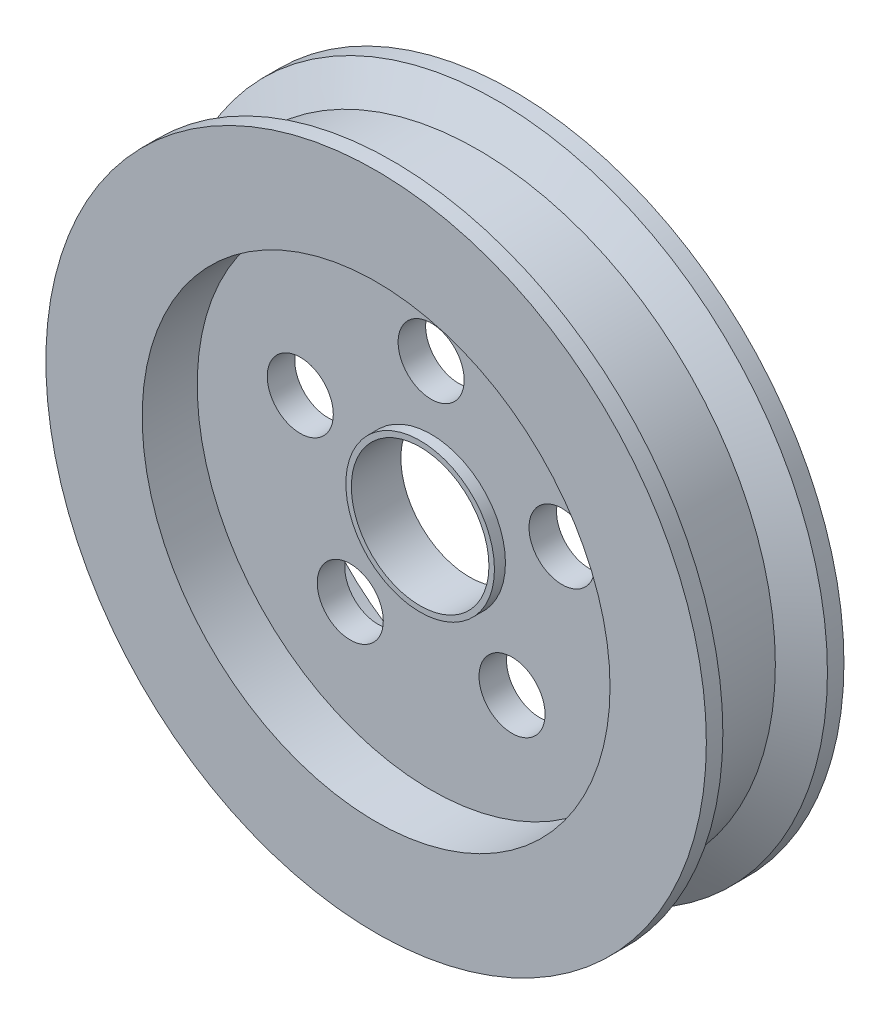
ISO-10303-21;
HEADER;
FILE_DESCRIPTION(('STEP AP214'),'2;1');
FILE_NAME('part.step','',(''),(''),'','','');
FILE_SCHEMA(('AUTOMOTIVE_DESIGN { 1 0 10303 214 1 1 1 1 }'));
ENDSEC;
DATA;
#1=APPLICATION_CONTEXT('core data for automotive mechanical design processes');
#2=APPLICATION_PROTOCOL_DEFINITION('international standard','automotive_design',2000,#1);
#3=PRODUCT_CONTEXT('',#1,'mechanical');
#4=PRODUCT('Part','Part','',(#3));
#5=PRODUCT_RELATED_PRODUCT_CATEGORY('part','',(#4));
#6=PRODUCT_DEFINITION_FORMATION('','',#4);
#7=PRODUCT_DEFINITION_CONTEXT('part definition',#1,'design');
#8=PRODUCT_DEFINITION('design','',#6,#7);
#9=PRODUCT_DEFINITION_SHAPE('','',#8);
#10=(LENGTH_UNIT() NAMED_UNIT(*) SI_UNIT(.MILLI.,.METRE.));
#11=(NAMED_UNIT(*) PLANE_ANGLE_UNIT() SI_UNIT($,.RADIAN.));
#12=(NAMED_UNIT(*) SI_UNIT($,.STERADIAN.) SOLID_ANGLE_UNIT());
#13=UNCERTAINTY_MEASURE_WITH_UNIT(LENGTH_MEASURE(1.E-05),#10,'distance_accuracy_value','');
#14=(GEOMETRIC_REPRESENTATION_CONTEXT(3) GLOBAL_UNCERTAINTY_ASSIGNED_CONTEXT((#13)) GLOBAL_UNIT_ASSIGNED_CONTEXT((#10,
#11,#12)) REPRESENTATION_CONTEXT('',''));
#15=CARTESIAN_POINT('',(0.,0.,0.));
#16=DIRECTION('',(0.,0.,1.));
#17=DIRECTION('',(1.,0.,0.));
#18=AXIS2_PLACEMENT_3D('',#15,#16,#17);
#19=CARTESIAN_POINT('',(0.,0.,12.5));
#20=DIRECTION('',(0.,0.,-1.));
#21=DIRECTION('',(-1.,0.,0.));
#22=AXIS2_PLACEMENT_3D('',#19,#20,#21);
#23=CYLINDRICAL_SURFACE('',#22,60.);
#24=CARTESIAN_POINT('',(0.,0.,-9.5));
#25=DIRECTION('',(0.,0.,1.));
#26=DIRECTION('',(1.,0.,0.));
#27=AXIS2_PLACEMENT_3D('',#24,#25,#26);
#28=CIRCLE('',#27,60.);
#29=CARTESIAN_POINT('',(60.,0.,-9.5));
#30=VERTEX_POINT('',#29);
#31=EDGE_CURVE('E61',#30,#30,#28,.T.);
#32=ORIENTED_EDGE('',*,*,#31,.F.);
#33=EDGE_LOOP('',(#32));
#34=FACE_BOUND('',#33,.T.);
#35=CARTESIAN_POINT('',(0.,0.,-12.5));
#36=DIRECTION('',(0.,0.,1.));
#37=DIRECTION('',(1.,0.,0.));
#38=AXIS2_PLACEMENT_3D('',#35,#36,#37);
#39=CIRCLE('',#38,60.);
#40=CARTESIAN_POINT('',(60.,0.,-12.5));
#41=VERTEX_POINT('',#40);
#42=EDGE_CURVE('E92',#41,#41,#39,.T.);
#43=ORIENTED_EDGE('',*,*,#42,.T.);
#44=EDGE_LOOP('',(#43));
#45=FACE_BOUND('',#44,.T.);
#46=ADVANCED_FACE('F35',(#34,#45),#23,.T.);
#47=CARTESIAN_POINT('',(0.,0.,12.5));
#48=DIRECTION('',(0.,0.,1.));
#49=DIRECTION('',(1.,0.,0.));
#50=AXIS2_PLACEMENT_3D('',#47,#48,#49);
#51=PLANE('',#50);
#52=CARTESIAN_POINT('',(0.,0.,12.5));
#53=DIRECTION('',(0.,0.,1.));
#54=DIRECTION('',(1.,0.,0.));
#55=AXIS2_PLACEMENT_3D('',#52,#53,#54);
#56=CIRCLE('',#55,42.5);
#57=CARTESIAN_POINT('',(42.5,0.,12.5));
#58=VERTEX_POINT('',#57);
#59=EDGE_CURVE('E85',#58,#58,#56,.T.);
#60=ORIENTED_EDGE('',*,*,#59,.F.);
#61=EDGE_LOOP('',(#60));
#62=FACE_BOUND('',#61,.T.);
#63=CARTESIAN_POINT('',(0.,0.,12.5));
#64=DIRECTION('',(0.,0.,1.));
#65=DIRECTION('',(1.,0.,0.));
#66=AXIS2_PLACEMENT_3D('',#63,#64,#65);
#67=CIRCLE('',#66,60.);
#68=CARTESIAN_POINT('',(60.,0.,12.5));
#69=VERTEX_POINT('',#68);
#70=EDGE_CURVE('E47',#69,#69,#67,.T.);
#71=ORIENTED_EDGE('',*,*,#70,.T.);
#72=EDGE_LOOP('',(#71));
#73=FACE_BOUND('',#72,.T.);
#74=ADVANCED_FACE('F140',(#62,#73),#51,.T.);
#75=CARTESIAN_POINT('',(0.,0.,-12.5));
#76=DIRECTION('',(0.,0.,1.));
#77=DIRECTION('',(1.,0.,0.));
#78=AXIS2_PLACEMENT_3D('',#75,#76,#77);
#79=PLANE('',#78);
#80=CARTESIAN_POINT('',(0.,0.,-12.5));
#81=DIRECTION('',(0.,0.,1.));
#82=DIRECTION('',(1.,0.,0.));
#83=AXIS2_PLACEMENT_3D('',#80,#81,#82);
#84=CIRCLE('',#83,42.5);
#85=CARTESIAN_POINT('',(42.5,0.,-12.5));
#86=VERTEX_POINT('',#85);
#87=EDGE_CURVE('E86',#86,#86,#84,.T.);
#88=ORIENTED_EDGE('',*,*,#87,.T.);
#89=EDGE_LOOP('',(#88));
#90=FACE_BOUND('',#89,.T.);
#91=ORIENTED_EDGE('',*,*,#42,.F.);
#92=EDGE_LOOP('',(#91));
#93=FACE_BOUND('',#92,.T.);
#94=ADVANCED_FACE('F137',(#90,#93),#79,.F.);
#95=CARTESIAN_POINT('',(0.,0.,9.5));
#96=DIRECTION('',(0.,0.,1.));
#97=DIRECTION('',(1.,0.,0.));
#98=AXIS2_PLACEMENT_3D('',#95,#96,#97);
#99=CIRCLE('',#98,60.);
#100=CARTESIAN_POINT('',(60.,0.,9.5));
#101=VERTEX_POINT('',#100);
#102=EDGE_CURVE('E52',#101,#101,#99,.T.);
#103=ORIENTED_EDGE('',*,*,#102,.T.);
#104=EDGE_LOOP('',(#103));
#105=FACE_BOUND('',#104,.T.);
#106=ORIENTED_EDGE('',*,*,#70,.F.);
#107=EDGE_LOOP('',(#106));
#108=FACE_BOUND('',#107,.T.);
#109=ADVANCED_FACE('F37',(#105,#108),#23,.T.);
#110=CARTESIAN_POINT('',(0.,0.,2.5));
#111=DIRECTION('',(0.,0.,1.));
#112=DIRECTION('',(1.,0.,0.));
#113=AXIS2_PLACEMENT_3D('',#110,#111,#112);
#114=CYLINDRICAL_SURFACE('',#113,42.5);
#115=CARTESIAN_POINT('',(0.,0.,2.5));
#116=DIRECTION('',(0.,0.,1.));
#117=DIRECTION('',(1.,0.,0.));
#118=AXIS2_PLACEMENT_3D('',#115,#116,#117);
#119=CIRCLE('',#118,42.5);
#120=CARTESIAN_POINT('',(42.5,0.,2.5));
#121=VERTEX_POINT('',#120);
#122=EDGE_CURVE('E89',#121,#121,#119,.T.);
#123=ORIENTED_EDGE('',*,*,#122,.F.);
#124=EDGE_LOOP('',(#123));
#125=FACE_BOUND('',#124,.T.);
#126=ORIENTED_EDGE('',*,*,#59,.T.);
#127=EDGE_LOOP('',(#126));
#128=FACE_BOUND('',#127,.T.);
#129=ADVANCED_FACE('F152',(#125,#128),#114,.F.);
#130=CARTESIAN_POINT('',(0.,0.,2.5));
#131=DIRECTION('',(0.,0.,1.));
#132=DIRECTION('',(1.,0.,0.));
#133=AXIS2_PLACEMENT_3D('',#130,#131,#132);
#134=PLANE('',#133);
#135=CARTESIAN_POINT('',(0.,0.,2.5));
#136=DIRECTION('',(0.,0.,1.));
#137=DIRECTION('',(1.,0.,0.));
#138=AXIS2_PLACEMENT_3D('',#135,#136,#137);
#139=CIRCLE('',#138,13.5);
#140=CARTESIAN_POINT('',(13.5,0.,2.5));
#141=VERTEX_POINT('',#140);
#142=EDGE_CURVE('E10',#141,#141,#139,.T.);
#143=ORIENTED_EDGE('',*,*,#142,.F.);
#144=EDGE_LOOP('',(#143));
#145=FACE_BOUND('',#144,.T.);
#146=CARTESIAN_POINT('',(23.7764129073788,7.72542485937396,2.5));
#147=DIRECTION('',(0.,0.,1.));
#148=DIRECTION('',(0.309016994374958,-0.95105651629515,0.));
#149=AXIS2_PLACEMENT_3D('',#146,#147,#148);
#150=CIRCLE('',#149,6.);
#151=CARTESIAN_POINT('',(29.7764129073788,7.72542485937396,2.5));
#152=VERTEX_POINT('',#151);
#153=EDGE_CURVE('E64',#152,#152,#150,.T.);
#154=ORIENTED_EDGE('',*,*,#153,.F.);
#155=EDGE_LOOP('',(#154));
#156=FACE_BOUND('',#155,.T.);
#157=CARTESIAN_POINT('',(14.694631307312,-20.2254248593736,2.5));
#158=DIRECTION('',(0.,0.,1.));
#159=DIRECTION('',(-0.809016994374942,-0.58778525229248,0.));
#160=AXIS2_PLACEMENT_3D('',#157,#158,#159);
#161=CIRCLE('',#160,6.);
#162=CARTESIAN_POINT('',(20.694631307312,-20.2254248593736,2.5));
#163=VERTEX_POINT('',#162);
#164=EDGE_CURVE('E69',#163,#163,#161,.T.);
#165=ORIENTED_EDGE('',*,*,#164,.F.);
#166=EDGE_LOOP('',(#165));
#167=FACE_BOUND('',#166,.T.);
#168=CARTESIAN_POINT('',(-14.6946313073117,-20.2254248593738,2.5));
#169=DIRECTION('',(0.,0.,1.));
#170=DIRECTION('',(-0.809016994374951,0.587785252292469,0.));
#171=AXIS2_PLACEMENT_3D('',#168,#169,#170);
#172=CIRCLE('',#171,6.);
#173=CARTESIAN_POINT('',(-8.69463130731171,-20.2254248593738,2.5));
#174=VERTEX_POINT('',#173);
#175=EDGE_CURVE('E65',#174,#174,#172,.T.);
#176=ORIENTED_EDGE('',*,*,#175,.F.);
#177=EDGE_LOOP('',(#176));
#178=FACE_BOUND('',#177,.T.);
#179=CARTESIAN_POINT('',(-23.7764129073789,7.72542485937362,2.5));
#180=DIRECTION('',(0.,0.,1.));
#181=DIRECTION('',(0.309016994374945,0.951056516295155,0.));
#182=AXIS2_PLACEMENT_3D('',#179,#180,#181);
#183=CIRCLE('',#182,6.);
#184=CARTESIAN_POINT('',(-17.7764129073789,7.72542485937362,2.5));
#185=VERTEX_POINT('',#184);
#186=EDGE_CURVE('E68',#185,#185,#183,.T.);
#187=ORIENTED_EDGE('',*,*,#186,.F.);
#188=EDGE_LOOP('',(#187));
#189=FACE_BOUND('',#188,.T.);
#190=CARTESIAN_POINT('',(0.,25.,2.5));
#191=DIRECTION('',(0.,0.,1.));
#192=DIRECTION('',(1.,0.,0.));
#193=AXIS2_PLACEMENT_3D('',#190,#191,#192);
#194=CIRCLE('',#193,6.);
#195=CARTESIAN_POINT('',(6.,25.,2.5));
#196=VERTEX_POINT('',#195);
#197=EDGE_CURVE('E77',#196,#196,#194,.T.);
#198=ORIENTED_EDGE('',*,*,#197,.F.);
#199=EDGE_LOOP('',(#198));
#200=FACE_BOUND('',#199,.T.);
#201=ORIENTED_EDGE('',*,*,#122,.T.);
#202=EDGE_LOOP('',(#201));
#203=FACE_BOUND('',#202,.T.);
#204=ADVANCED_FACE('F133',(#145,#156,#167,#178,#189,#200,#203),#134,.T.);
#205=CARTESIAN_POINT('',(0.,0.,-2.5));
#206=DIRECTION('',(0.,0.,-1.));
#207=DIRECTION('',(-1.,0.,0.));
#208=AXIS2_PLACEMENT_3D('',#205,#206,#207);
#209=CYLINDRICAL_SURFACE('',#208,42.5);
#210=CARTESIAN_POINT('',(0.,0.,-2.5));
#211=DIRECTION('',(0.,0.,1.));
#212=DIRECTION('',(1.,0.,0.));
#213=AXIS2_PLACEMENT_3D('',#210,#211,#212);
#214=CIRCLE('',#213,42.5);
#215=CARTESIAN_POINT('',(42.5,0.,-2.5));
#216=VERTEX_POINT('',#215);
#217=EDGE_CURVE('E82',#216,#216,#214,.T.);
#218=ORIENTED_EDGE('',*,*,#217,.T.);
#219=EDGE_LOOP('',(#218));
#220=FACE_BOUND('',#219,.T.);
#221=ORIENTED_EDGE('',*,*,#87,.F.);
#222=EDGE_LOOP('',(#221));
#223=FACE_BOUND('',#222,.T.);
#224=ADVANCED_FACE('F118',(#220,#223),#209,.F.);
#225=CARTESIAN_POINT('',(0.,0.,-2.5));
#226=DIRECTION('',(0.,0.,-1.));
#227=DIRECTION('',(1.,0.,0.));
#228=AXIS2_PLACEMENT_3D('',#225,#226,#227);
#229=PLANE('',#228);
#230=CARTESIAN_POINT('',(0.,0.,-2.5));
#231=DIRECTION('',(0.,0.,-1.));
#232=DIRECTION('',(-1.,0.,0.));
#233=AXIS2_PLACEMENT_3D('',#230,#231,#232);
#234=CIRCLE('',#233,13.5);
#235=CARTESIAN_POINT('',(-13.5,0.,-2.5));
#236=VERTEX_POINT('',#235);
#237=EDGE_CURVE('E39',#236,#236,#234,.T.);
#238=ORIENTED_EDGE('',*,*,#237,.F.);
#239=EDGE_LOOP('',(#238));
#240=FACE_BOUND('',#239,.T.);
#241=CARTESIAN_POINT('',(23.7764129073788,7.72542485937396,-2.5));
#242=DIRECTION('',(0.,0.,-1.));
#243=DIRECTION('',(-1.,0.,0.));
#244=AXIS2_PLACEMENT_3D('',#241,#242,#243);
#245=CIRCLE('',#244,6.);
#246=CARTESIAN_POINT('',(29.7764129073788,7.72542485937396,-2.5));
#247=VERTEX_POINT('',#246);
#248=EDGE_CURVE('E81',#247,#247,#245,.T.);
#249=ORIENTED_EDGE('',*,*,#248,.F.);
#250=EDGE_LOOP('',(#249));
#251=FACE_BOUND('',#250,.T.);
#252=CARTESIAN_POINT('',(14.694631307312,-20.2254248593736,-2.5));
#253=DIRECTION('',(0.,0.,-1.));
#254=DIRECTION('',(-1.,0.,0.));
#255=AXIS2_PLACEMENT_3D('',#252,#253,#254);
#256=CIRCLE('',#255,6.);
#257=CARTESIAN_POINT('',(20.694631307312,-20.2254248593736,-2.5));
#258=VERTEX_POINT('',#257);
#259=EDGE_CURVE('E106',#258,#258,#256,.T.);
#260=ORIENTED_EDGE('',*,*,#259,.F.);
#261=EDGE_LOOP('',(#260));
#262=FACE_BOUND('',#261,.T.);
#263=CARTESIAN_POINT('',(-14.6946313073117,-20.2254248593738,-2.5));
#264=DIRECTION('',(0.,0.,-1.));
#265=DIRECTION('',(-1.,0.,0.));
#266=AXIS2_PLACEMENT_3D('',#263,#264,#265);
#267=CIRCLE('',#266,6.);
#268=CARTESIAN_POINT('',(-8.69463130731171,-20.2254248593738,-2.5));
#269=VERTEX_POINT('',#268);
#270=EDGE_CURVE('E103',#269,#269,#267,.T.);
#271=ORIENTED_EDGE('',*,*,#270,.F.);
#272=EDGE_LOOP('',(#271));
#273=FACE_BOUND('',#272,.T.);
#274=CARTESIAN_POINT('',(-23.7764129073789,7.72542485937362,-2.5));
#275=DIRECTION('',(0.,0.,-1.));
#276=DIRECTION('',(-1.,0.,0.));
#277=AXIS2_PLACEMENT_3D('',#274,#275,#276);
#278=CIRCLE('',#277,6.);
#279=CARTESIAN_POINT('',(-17.7764129073789,7.72542485937362,-2.5));
#280=VERTEX_POINT('',#279);
#281=EDGE_CURVE('E76',#280,#280,#278,.T.);
#282=ORIENTED_EDGE('',*,*,#281,.F.);
#283=EDGE_LOOP('',(#282));
#284=FACE_BOUND('',#283,.T.);
#285=CARTESIAN_POINT('',(0.,25.,-2.5));
#286=DIRECTION('',(0.,0.,-1.));
#287=DIRECTION('',(-1.,0.,0.));
#288=AXIS2_PLACEMENT_3D('',#285,#286,#287);
#289=CIRCLE('',#288,6.);
#290=CARTESIAN_POINT('',(6.,25.,-2.5));
#291=VERTEX_POINT('',#290);
#292=EDGE_CURVE('E80',#291,#291,#289,.T.);
#293=ORIENTED_EDGE('',*,*,#292,.F.);
#294=EDGE_LOOP('',(#293));
#295=FACE_BOUND('',#294,.T.);
#296=ORIENTED_EDGE('',*,*,#217,.F.);
#297=EDGE_LOOP('',(#296));
#298=FACE_BOUND('',#297,.T.);
#299=ADVANCED_FACE('F114',(#240,#251,#262,#273,#284,#295,#298),#229,.T.);
#300=CARTESIAN_POINT('',(0.,25.,-12.5));
#301=DIRECTION('',(0.,0.,1.));
#302=DIRECTION('',(1.,0.,0.));
#303=AXIS2_PLACEMENT_3D('',#300,#301,#302);
#304=CYLINDRICAL_SURFACE('',#303,6.);
#305=CARTESIAN_POINT('',(6.,25.,-2.5));
#306=CARTESIAN_POINT('',(6.,25.,-2.44791666666667));
#307=CARTESIAN_POINT('',(6.,25.,-2.39583333333333));
#308=CARTESIAN_POINT('',(6.,25.,-2.29166666666667));
#309=CARTESIAN_POINT('',(6.,25.,-2.23958333333333));
#310=CARTESIAN_POINT('',(6.,25.,-2.13541666666667));
#311=CARTESIAN_POINT('',(6.,25.,-2.08333333333333));
#312=CARTESIAN_POINT('',(6.,25.,-1.97916666666667));
#313=CARTESIAN_POINT('',(6.,25.,-1.92708333333333));
#314=CARTESIAN_POINT('',(6.,25.,-1.82291666666667));
#315=CARTESIAN_POINT('',(6.,25.,-1.77083333333333));
#316=CARTESIAN_POINT('',(6.,25.,-1.66666666666667));
#317=CARTESIAN_POINT('',(6.,25.,-1.61458333333333));
#318=CARTESIAN_POINT('',(6.,25.,-1.51041666666667));
#319=CARTESIAN_POINT('',(6.,25.,-1.45833333333333));
#320=CARTESIAN_POINT('',(6.,25.,-1.35416666666667));
#321=CARTESIAN_POINT('',(6.,25.,-1.30208333333333));
#322=CARTESIAN_POINT('',(6.,25.,-1.19791666666667));
#323=CARTESIAN_POINT('',(6.,25.,-1.14583333333333));
#324=CARTESIAN_POINT('',(6.,25.,-1.04166666666667));
#325=CARTESIAN_POINT('',(6.,25.,-0.989583333333334));
#326=CARTESIAN_POINT('',(6.,25.,-0.885416666666668));
#327=CARTESIAN_POINT('',(6.,25.,-0.833333333333334));
#328=CARTESIAN_POINT('',(6.,25.,-0.729166666666667));
#329=CARTESIAN_POINT('',(6.,25.,-0.677083333333334));
#330=CARTESIAN_POINT('',(6.,25.,-0.572916666666667));
#331=CARTESIAN_POINT('',(6.,25.,-0.520833333333334));
#332=CARTESIAN_POINT('',(6.,25.,-0.416666666666667));
#333=CARTESIAN_POINT('',(6.,25.,-0.364583333333334));
#334=CARTESIAN_POINT('',(6.,25.,-0.260416666666667));
#335=CARTESIAN_POINT('',(6.,25.,-0.208333333333334));
#336=CARTESIAN_POINT('',(6.,25.,-0.104166666666667));
#337=CARTESIAN_POINT('',(6.,25.,-0.0520833333333334));
#338=CARTESIAN_POINT('',(6.,25.,0.0520833333333334));
#339=CARTESIAN_POINT('',(6.,25.,0.104166666666667));
#340=CARTESIAN_POINT('',(6.,25.,0.208333333333334));
#341=CARTESIAN_POINT('',(6.,25.,0.260416666666667));
#342=CARTESIAN_POINT('',(6.,25.,0.364583333333334));
#343=CARTESIAN_POINT('',(6.,25.,0.416666666666667));
#344=CARTESIAN_POINT('',(6.,25.,0.520833333333334));
#345=CARTESIAN_POINT('',(6.,25.,0.572916666666667));
#346=CARTESIAN_POINT('',(6.,25.,0.677083333333334));
#347=CARTESIAN_POINT('',(6.,25.,0.729166666666667));
#348=CARTESIAN_POINT('',(6.,25.,0.833333333333333));
#349=CARTESIAN_POINT('',(6.,25.,0.885416666666666));
#350=CARTESIAN_POINT('',(6.,25.,0.989583333333333));
#351=CARTESIAN_POINT('',(6.,25.,1.04166666666667));
#352=CARTESIAN_POINT('',(6.,25.,1.14583333333333));
#353=CARTESIAN_POINT('',(6.,25.,1.19791666666667));
#354=CARTESIAN_POINT('',(6.,25.,1.30208333333333));
#355=CARTESIAN_POINT('',(6.,25.,1.35416666666667));
#356=CARTESIAN_POINT('',(6.,25.,1.45833333333333));
#357=CARTESIAN_POINT('',(6.,25.,1.51041666666667));
#358=CARTESIAN_POINT('',(6.,25.,1.61458333333333));
#359=CARTESIAN_POINT('',(6.,25.,1.66666666666667));
#360=CARTESIAN_POINT('',(6.,25.,1.77083333333333));
#361=CARTESIAN_POINT('',(6.,25.,1.82291666666667));
#362=CARTESIAN_POINT('',(6.,25.,1.92708333333333));
#363=CARTESIAN_POINT('',(6.,25.,1.97916666666667));
#364=CARTESIAN_POINT('',(6.,25.,2.08333333333333));
#365=CARTESIAN_POINT('',(6.,25.,2.13541666666667));
#366=CARTESIAN_POINT('',(6.,25.,2.23958333333333));
#367=CARTESIAN_POINT('',(6.,25.,2.29166666666667));
#368=CARTESIAN_POINT('',(6.,25.,2.39583333333333));
#369=CARTESIAN_POINT('',(6.,25.,2.44791666666667));
#370=CARTESIAN_POINT('',(6.,25.,2.5));
#371=B_SPLINE_CURVE_WITH_KNOTS('',3,(#305,#306,#307,#308,#309,#310,#311,#312,#313,#314,#315,
#316,#317,#318,#319,#320,#321,#322,#323,#324,#325,#326,#327,#328,#329,#330,#331,#332,#333,#334,
#335,#336,#337,#338,#339,#340,#341,#342,#343,#344,#345,#346,#347,#348,#349,#350,#351,#352,#353,
#354,#355,#356,#357,#358,#359,#360,#361,#362,#363,#364,#365,#366,#367,#368,#369,#370),
.UNSPECIFIED.,.F.,.F.,(4,2,2,2,2,2,2,2,2,2,2,2,2,2,2,2,2,2,2,2,2,2,2,2,2,2,2,2,2,2,2,2,4),(0.,
0.15625,0.3125,0.46875,0.625000000000001,0.781250000000001,0.937500000000001,1.09375,1.25,
1.40625,1.5625,1.71875,1.875,2.03125,2.1875,2.34375,2.5,2.65625,2.8125,2.96875,3.125,3.28125,
3.4375,3.59375,3.75,3.90625,4.0625,4.21875,4.375,4.53125,4.6875,4.84375,5.),.UNSPECIFIED.);
#372=EDGE_CURVE('BSEAM117',#291,#196,#371,.T.);
#373=ORIENTED_EDGE('',*,*,#292,.T.);
#374=ORIENTED_EDGE('',*,*,#197,.T.);
#375=ORIENTED_EDGE('',*,*,#372,.T.);
#376=ORIENTED_EDGE('',*,*,#372,.F.);
#377=EDGE_LOOP('',(#373,#375,#374,#376));
#378=FACE_BOUND('',#377,.T.);
#379=ADVANCED_FACE('F117',(#378),#304,.F.);
#380=CARTESIAN_POINT('',(-23.7764129073789,7.72542485937362,-12.5));
#381=DIRECTION('',(0.,0.,1.));
#382=DIRECTION('',(1.,0.,0.));
#383=AXIS2_PLACEMENT_3D('',#380,#381,#382);
#384=CYLINDRICAL_SURFACE('',#383,6.);
#385=CARTESIAN_POINT('',(-17.7764129073789,7.72542485937362,-2.5));
#386=CARTESIAN_POINT('',(-17.7764129073789,7.72542485937362,-2.44791666666667));
#387=CARTESIAN_POINT('',(-17.7764129073789,7.72542485937362,-2.39583333333333));
#388=CARTESIAN_POINT('',(-17.7764129073789,7.72542485937362,-2.29166666666667));
#389=CARTESIAN_POINT('',(-17.7764129073789,7.72542485937362,-2.23958333333333));
#390=CARTESIAN_POINT('',(-17.7764129073789,7.72542485937362,-2.13541666666667));
#391=CARTESIAN_POINT('',(-17.7764129073789,7.72542485937362,-2.08333333333333));
#392=CARTESIAN_POINT('',(-17.7764129073789,7.72542485937362,-1.97916666666667));
#393=CARTESIAN_POINT('',(-17.7764129073789,7.72542485937362,-1.92708333333333));
#394=CARTESIAN_POINT('',(-17.7764129073789,7.72542485937362,-1.82291666666667));
#395=CARTESIAN_POINT('',(-17.7764129073789,7.72542485937362,-1.77083333333333));
#396=CARTESIAN_POINT('',(-17.7764129073789,7.72542485937362,-1.66666666666667));
#397=CARTESIAN_POINT('',(-17.7764129073789,7.72542485937362,-1.61458333333333));
#398=CARTESIAN_POINT('',(-17.7764129073789,7.72542485937362,-1.51041666666667));
#399=CARTESIAN_POINT('',(-17.7764129073789,7.72542485937362,-1.45833333333333));
#400=CARTESIAN_POINT('',(-17.7764129073789,7.72542485937362,-1.35416666666667));
#401=CARTESIAN_POINT('',(-17.7764129073789,7.72542485937362,-1.30208333333333));
#402=CARTESIAN_POINT('',(-17.7764129073789,7.72542485937362,-1.19791666666667));
#403=CARTESIAN_POINT('',(-17.7764129073789,7.72542485937362,-1.14583333333333));
#404=CARTESIAN_POINT('',(-17.7764129073789,7.72542485937362,-1.04166666666667));
#405=CARTESIAN_POINT('',(-17.7764129073789,7.72542485937362,-0.989583333333334));
#406=CARTESIAN_POINT('',(-17.7764129073789,7.72542485937362,-0.885416666666668));
#407=CARTESIAN_POINT('',(-17.7764129073789,7.72542485937362,-0.833333333333334));
#408=CARTESIAN_POINT('',(-17.7764129073789,7.72542485937362,-0.729166666666667));
#409=CARTESIAN_POINT('',(-17.7764129073789,7.72542485937362,-0.677083333333334));
#410=CARTESIAN_POINT('',(-17.7764129073789,7.72542485937362,-0.572916666666667));
#411=CARTESIAN_POINT('',(-17.7764129073789,7.72542485937362,-0.520833333333334));
#412=CARTESIAN_POINT('',(-17.7764129073789,7.72542485937362,-0.416666666666667));
#413=CARTESIAN_POINT('',(-17.7764129073789,7.72542485937362,-0.364583333333334));
#414=CARTESIAN_POINT('',(-17.7764129073789,7.72542485937362,-0.260416666666667));
#415=CARTESIAN_POINT('',(-17.7764129073789,7.72542485937362,-0.208333333333334));
#416=CARTESIAN_POINT('',(-17.7764129073789,7.72542485937362,-0.104166666666667));
#417=CARTESIAN_POINT('',(-17.7764129073789,7.72542485937362,-0.0520833333333334));
#418=CARTESIAN_POINT('',(-17.7764129073789,7.72542485937362,0.0520833333333334));
#419=CARTESIAN_POINT('',(-17.7764129073789,7.72542485937362,0.104166666666667));
#420=CARTESIAN_POINT('',(-17.7764129073789,7.72542485937362,0.208333333333334));
#421=CARTESIAN_POINT('',(-17.7764129073789,7.72542485937362,0.260416666666667));
#422=CARTESIAN_POINT('',(-17.7764129073789,7.72542485937362,0.364583333333334));
#423=CARTESIAN_POINT('',(-17.7764129073789,7.72542485937362,0.416666666666667));
#424=CARTESIAN_POINT('',(-17.7764129073789,7.72542485937362,0.520833333333334));
#425=CARTESIAN_POINT('',(-17.7764129073789,7.72542485937362,0.572916666666667));
#426=CARTESIAN_POINT('',(-17.7764129073789,7.72542485937362,0.677083333333334));
#427=CARTESIAN_POINT('',(-17.7764129073789,7.72542485937362,0.729166666666667));
#428=CARTESIAN_POINT('',(-17.7764129073789,7.72542485937362,0.833333333333333));
#429=CARTESIAN_POINT('',(-17.7764129073789,7.72542485937362,0.885416666666666));
#430=CARTESIAN_POINT('',(-17.7764129073789,7.72542485937362,0.989583333333333));
#431=CARTESIAN_POINT('',(-17.7764129073789,7.72542485937362,1.04166666666667));
#432=CARTESIAN_POINT('',(-17.7764129073789,7.72542485937362,1.14583333333333));
#433=CARTESIAN_POINT('',(-17.7764129073789,7.72542485937362,1.19791666666667));
#434=CARTESIAN_POINT('',(-17.7764129073789,7.72542485937362,1.30208333333333));
#435=CARTESIAN_POINT('',(-17.7764129073789,7.72542485937362,1.35416666666667));
#436=CARTESIAN_POINT('',(-17.7764129073789,7.72542485937362,1.45833333333333));
#437=CARTESIAN_POINT('',(-17.7764129073789,7.72542485937362,1.51041666666667));
#438=CARTESIAN_POINT('',(-17.7764129073789,7.72542485937362,1.61458333333333));
#439=CARTESIAN_POINT('',(-17.7764129073789,7.72542485937362,1.66666666666667));
#440=CARTESIAN_POINT('',(-17.7764129073789,7.72542485937362,1.77083333333333));
#441=CARTESIAN_POINT('',(-17.7764129073789,7.72542485937362,1.82291666666667));
#442=CARTESIAN_POINT('',(-17.7764129073789,7.72542485937362,1.92708333333333));
#443=CARTESIAN_POINT('',(-17.7764129073789,7.72542485937362,1.97916666666667));
#444=CARTESIAN_POINT('',(-17.7764129073789,7.72542485937362,2.08333333333333));
#445=CARTESIAN_POINT('',(-17.7764129073789,7.72542485937362,2.13541666666667));
#446=CARTESIAN_POINT('',(-17.7764129073789,7.72542485937362,2.23958333333333));
#447=CARTESIAN_POINT('',(-17.7764129073789,7.72542485937362,2.29166666666667));
#448=CARTESIAN_POINT('',(-17.7764129073789,7.72542485937362,2.39583333333333));
#449=CARTESIAN_POINT('',(-17.7764129073789,7.72542485937362,2.44791666666667));
#450=CARTESIAN_POINT('',(-17.7764129073789,7.72542485937362,2.5));
#451=B_SPLINE_CURVE_WITH_KNOTS('',3,(#385,#386,#387,#388,#389,#390,#391,#392,#393,#394,#395,
#396,#397,#398,#399,#400,#401,#402,#403,#404,#405,#406,#407,#408,#409,#410,#411,#412,#413,#414,
#415,#416,#417,#418,#419,#420,#421,#422,#423,#424,#425,#426,#427,#428,#429,#430,#431,#432,#433,
#434,#435,#436,#437,#438,#439,#440,#441,#442,#443,#444,#445,#446,#447,#448,#449,#450),
.UNSPECIFIED.,.F.,.F.,(4,2,2,2,2,2,2,2,2,2,2,2,2,2,2,2,2,2,2,2,2,2,2,2,2,2,2,2,2,2,2,2,4),(0.,
0.15625,0.3125,0.46875,0.625000000000001,0.781250000000001,0.937500000000001,1.09375,1.25,
1.40625,1.5625,1.71875,1.875,2.03125,2.1875,2.34375,2.5,2.65625,2.8125,2.96875,3.125,3.28125,
3.4375,3.59375,3.75,3.90625,4.0625,4.21875,4.375,4.53125,4.6875,4.84375,5.),.UNSPECIFIED.);
#452=EDGE_CURVE('BSEAM190',#280,#185,#451,.T.);
#453=ORIENTED_EDGE('',*,*,#281,.T.);
#454=ORIENTED_EDGE('',*,*,#186,.T.);
#455=ORIENTED_EDGE('',*,*,#452,.T.);
#456=ORIENTED_EDGE('',*,*,#452,.F.);
#457=EDGE_LOOP('',(#453,#455,#454,#456));
#458=FACE_BOUND('',#457,.T.);
#459=ADVANCED_FACE('F190',(#458),#384,.F.);
#460=CARTESIAN_POINT('',(-14.6946313073117,-20.2254248593738,-12.5));
#461=DIRECTION('',(0.,0.,1.));
#462=DIRECTION('',(1.,0.,0.));
#463=AXIS2_PLACEMENT_3D('',#460,#461,#462);
#464=CYLINDRICAL_SURFACE('',#463,6.);
#465=CARTESIAN_POINT('',(-8.69463130731171,-20.2254248593738,-2.5));
#466=CARTESIAN_POINT('',(-8.69463130731171,-20.2254248593738,-2.44791666666667));
#467=CARTESIAN_POINT('',(-8.69463130731171,-20.2254248593738,-2.39583333333333));
#468=CARTESIAN_POINT('',(-8.69463130731171,-20.2254248593738,-2.29166666666667));
#469=CARTESIAN_POINT('',(-8.69463130731171,-20.2254248593738,-2.23958333333333));
#470=CARTESIAN_POINT('',(-8.69463130731171,-20.2254248593738,-2.13541666666667));
#471=CARTESIAN_POINT('',(-8.69463130731171,-20.2254248593738,-2.08333333333333));
#472=CARTESIAN_POINT('',(-8.69463130731171,-20.2254248593738,-1.97916666666667));
#473=CARTESIAN_POINT('',(-8.69463130731171,-20.2254248593738,-1.92708333333333));
#474=CARTESIAN_POINT('',(-8.69463130731171,-20.2254248593738,-1.82291666666667));
#475=CARTESIAN_POINT('',(-8.69463130731171,-20.2254248593738,-1.77083333333333));
#476=CARTESIAN_POINT('',(-8.69463130731171,-20.2254248593738,-1.66666666666667));
#477=CARTESIAN_POINT('',(-8.69463130731171,-20.2254248593738,-1.61458333333333));
#478=CARTESIAN_POINT('',(-8.69463130731171,-20.2254248593738,-1.51041666666667));
#479=CARTESIAN_POINT('',(-8.69463130731171,-20.2254248593738,-1.45833333333333));
#480=CARTESIAN_POINT('',(-8.69463130731171,-20.2254248593738,-1.35416666666667));
#481=CARTESIAN_POINT('',(-8.69463130731171,-20.2254248593738,-1.30208333333333));
#482=CARTESIAN_POINT('',(-8.69463130731171,-20.2254248593738,-1.19791666666667));
#483=CARTESIAN_POINT('',(-8.69463130731171,-20.2254248593738,-1.14583333333333));
#484=CARTESIAN_POINT('',(-8.69463130731171,-20.2254248593738,-1.04166666666667));
#485=CARTESIAN_POINT('',(-8.69463130731171,-20.2254248593738,-0.989583333333334));
#486=CARTESIAN_POINT('',(-8.69463130731171,-20.2254248593738,-0.885416666666668));
#487=CARTESIAN_POINT('',(-8.69463130731171,-20.2254248593738,-0.833333333333334));
#488=CARTESIAN_POINT('',(-8.69463130731171,-20.2254248593738,-0.729166666666667));
#489=CARTESIAN_POINT('',(-8.69463130731171,-20.2254248593738,-0.677083333333334));
#490=CARTESIAN_POINT('',(-8.69463130731171,-20.2254248593738,-0.572916666666667));
#491=CARTESIAN_POINT('',(-8.69463130731171,-20.2254248593738,-0.520833333333334));
#492=CARTESIAN_POINT('',(-8.69463130731171,-20.2254248593738,-0.416666666666667));
#493=CARTESIAN_POINT('',(-8.69463130731171,-20.2254248593738,-0.364583333333334));
#494=CARTESIAN_POINT('',(-8.69463130731171,-20.2254248593738,-0.260416666666667));
#495=CARTESIAN_POINT('',(-8.69463130731171,-20.2254248593738,-0.208333333333334));
#496=CARTESIAN_POINT('',(-8.69463130731171,-20.2254248593738,-0.104166666666667));
#497=CARTESIAN_POINT('',(-8.69463130731171,-20.2254248593738,-0.0520833333333334));
#498=CARTESIAN_POINT('',(-8.69463130731171,-20.2254248593738,0.0520833333333334));
#499=CARTESIAN_POINT('',(-8.69463130731171,-20.2254248593738,0.104166666666667));
#500=CARTESIAN_POINT('',(-8.69463130731171,-20.2254248593738,0.208333333333334));
#501=CARTESIAN_POINT('',(-8.69463130731171,-20.2254248593738,0.260416666666667));
#502=CARTESIAN_POINT('',(-8.69463130731171,-20.2254248593738,0.364583333333334));
#503=CARTESIAN_POINT('',(-8.69463130731171,-20.2254248593738,0.416666666666667));
#504=CARTESIAN_POINT('',(-8.69463130731171,-20.2254248593738,0.520833333333334));
#505=CARTESIAN_POINT('',(-8.69463130731171,-20.2254248593738,0.572916666666667));
#506=CARTESIAN_POINT('',(-8.69463130731171,-20.2254248593738,0.677083333333334));
#507=CARTESIAN_POINT('',(-8.69463130731171,-20.2254248593738,0.729166666666667));
#508=CARTESIAN_POINT('',(-8.69463130731171,-20.2254248593738,0.833333333333333));
#509=CARTESIAN_POINT('',(-8.69463130731171,-20.2254248593738,0.885416666666666));
#510=CARTESIAN_POINT('',(-8.69463130731171,-20.2254248593738,0.989583333333333));
#511=CARTESIAN_POINT('',(-8.69463130731171,-20.2254248593738,1.04166666666667));
#512=CARTESIAN_POINT('',(-8.69463130731171,-20.2254248593738,1.14583333333333));
#513=CARTESIAN_POINT('',(-8.69463130731171,-20.2254248593738,1.19791666666667));
#514=CARTESIAN_POINT('',(-8.69463130731171,-20.2254248593738,1.30208333333333));
#515=CARTESIAN_POINT('',(-8.69463130731171,-20.2254248593738,1.35416666666667));
#516=CARTESIAN_POINT('',(-8.69463130731171,-20.2254248593738,1.45833333333333));
#517=CARTESIAN_POINT('',(-8.69463130731171,-20.2254248593738,1.51041666666667));
#518=CARTESIAN_POINT('',(-8.69463130731171,-20.2254248593738,1.61458333333333));
#519=CARTESIAN_POINT('',(-8.69463130731171,-20.2254248593738,1.66666666666667));
#520=CARTESIAN_POINT('',(-8.69463130731171,-20.2254248593738,1.77083333333333));
#521=CARTESIAN_POINT('',(-8.69463130731171,-20.2254248593738,1.82291666666667));
#522=CARTESIAN_POINT('',(-8.69463130731171,-20.2254248593738,1.92708333333333));
#523=CARTESIAN_POINT('',(-8.69463130731171,-20.2254248593738,1.97916666666667));
#524=CARTESIAN_POINT('',(-8.69463130731171,-20.2254248593738,2.08333333333333));
#525=CARTESIAN_POINT('',(-8.69463130731171,-20.2254248593738,2.13541666666667));
#526=CARTESIAN_POINT('',(-8.69463130731171,-20.2254248593738,2.23958333333333));
#527=CARTESIAN_POINT('',(-8.69463130731171,-20.2254248593738,2.29166666666667));
#528=CARTESIAN_POINT('',(-8.69463130731171,-20.2254248593738,2.39583333333333));
#529=CARTESIAN_POINT('',(-8.69463130731171,-20.2254248593738,2.44791666666667));
#530=CARTESIAN_POINT('',(-8.69463130731171,-20.2254248593738,2.5));
#531=B_SPLINE_CURVE_WITH_KNOTS('',3,(#465,#466,#467,#468,#469,#470,#471,#472,#473,#474,#475,
#476,#477,#478,#479,#480,#481,#482,#483,#484,#485,#486,#487,#488,#489,#490,#491,#492,#493,#494,
#495,#496,#497,#498,#499,#500,#501,#502,#503,#504,#505,#506,#507,#508,#509,#510,#511,#512,#513,
#514,#515,#516,#517,#518,#519,#520,#521,#522,#523,#524,#525,#526,#527,#528,#529,#530),
.UNSPECIFIED.,.F.,.F.,(4,2,2,2,2,2,2,2,2,2,2,2,2,2,2,2,2,2,2,2,2,2,2,2,2,2,2,2,2,2,2,2,4),(0.,
0.15625,0.3125,0.46875,0.625000000000001,0.781250000000001,0.937500000000001,1.09375,1.25,
1.40625,1.5625,1.71875,1.875,2.03125,2.1875,2.34375,2.5,2.65625,2.8125,2.96875,3.125,3.28125,
3.4375,3.59375,3.75,3.90625,4.0625,4.21875,4.375,4.53125,4.6875,4.84375,5.),.UNSPECIFIED.);
#532=EDGE_CURVE('BSEAM187',#269,#174,#531,.T.);
#533=ORIENTED_EDGE('',*,*,#270,.T.);
#534=ORIENTED_EDGE('',*,*,#175,.T.);
#535=ORIENTED_EDGE('',*,*,#532,.T.);
#536=ORIENTED_EDGE('',*,*,#532,.F.);
#537=EDGE_LOOP('',(#533,#535,#534,#536));
#538=FACE_BOUND('',#537,.T.);
#539=ADVANCED_FACE('F187',(#538),#464,.F.);
#540=CARTESIAN_POINT('',(14.694631307312,-20.2254248593736,-12.5));
#541=DIRECTION('',(0.,0.,1.));
#542=DIRECTION('',(1.,0.,0.));
#543=AXIS2_PLACEMENT_3D('',#540,#541,#542);
#544=CYLINDRICAL_SURFACE('',#543,6.);
#545=CARTESIAN_POINT('',(20.694631307312,-20.2254248593736,-2.5));
#546=CARTESIAN_POINT('',(20.694631307312,-20.2254248593736,-2.44791666666667));
#547=CARTESIAN_POINT('',(20.694631307312,-20.2254248593736,-2.39583333333333));
#548=CARTESIAN_POINT('',(20.694631307312,-20.2254248593736,-2.29166666666667));
#549=CARTESIAN_POINT('',(20.694631307312,-20.2254248593736,-2.23958333333333));
#550=CARTESIAN_POINT('',(20.694631307312,-20.2254248593736,-2.13541666666667));
#551=CARTESIAN_POINT('',(20.694631307312,-20.2254248593736,-2.08333333333333));
#552=CARTESIAN_POINT('',(20.694631307312,-20.2254248593736,-1.97916666666667));
#553=CARTESIAN_POINT('',(20.694631307312,-20.2254248593736,-1.92708333333333));
#554=CARTESIAN_POINT('',(20.694631307312,-20.2254248593736,-1.82291666666667));
#555=CARTESIAN_POINT('',(20.694631307312,-20.2254248593736,-1.77083333333333));
#556=CARTESIAN_POINT('',(20.694631307312,-20.2254248593736,-1.66666666666667));
#557=CARTESIAN_POINT('',(20.694631307312,-20.2254248593736,-1.61458333333333));
#558=CARTESIAN_POINT('',(20.694631307312,-20.2254248593736,-1.51041666666667));
#559=CARTESIAN_POINT('',(20.694631307312,-20.2254248593736,-1.45833333333333));
#560=CARTESIAN_POINT('',(20.694631307312,-20.2254248593736,-1.35416666666667));
#561=CARTESIAN_POINT('',(20.694631307312,-20.2254248593736,-1.30208333333333));
#562=CARTESIAN_POINT('',(20.694631307312,-20.2254248593736,-1.19791666666667));
#563=CARTESIAN_POINT('',(20.694631307312,-20.2254248593736,-1.14583333333333));
#564=CARTESIAN_POINT('',(20.694631307312,-20.2254248593736,-1.04166666666667));
#565=CARTESIAN_POINT('',(20.694631307312,-20.2254248593736,-0.989583333333334));
#566=CARTESIAN_POINT('',(20.694631307312,-20.2254248593736,-0.885416666666668));
#567=CARTESIAN_POINT('',(20.694631307312,-20.2254248593736,-0.833333333333334));
#568=CARTESIAN_POINT('',(20.694631307312,-20.2254248593736,-0.729166666666667));
#569=CARTESIAN_POINT('',(20.694631307312,-20.2254248593736,-0.677083333333334));
#570=CARTESIAN_POINT('',(20.694631307312,-20.2254248593736,-0.572916666666667));
#571=CARTESIAN_POINT('',(20.694631307312,-20.2254248593736,-0.520833333333334));
#572=CARTESIAN_POINT('',(20.694631307312,-20.2254248593736,-0.416666666666667));
#573=CARTESIAN_POINT('',(20.694631307312,-20.2254248593736,-0.364583333333334));
#574=CARTESIAN_POINT('',(20.694631307312,-20.2254248593736,-0.260416666666667));
#575=CARTESIAN_POINT('',(20.694631307312,-20.2254248593736,-0.208333333333334));
#576=CARTESIAN_POINT('',(20.694631307312,-20.2254248593736,-0.104166666666667));
#577=CARTESIAN_POINT('',(20.694631307312,-20.2254248593736,-0.0520833333333334));
#578=CARTESIAN_POINT('',(20.694631307312,-20.2254248593736,0.0520833333333334));
#579=CARTESIAN_POINT('',(20.694631307312,-20.2254248593736,0.104166666666667));
#580=CARTESIAN_POINT('',(20.694631307312,-20.2254248593736,0.208333333333334));
#581=CARTESIAN_POINT('',(20.694631307312,-20.2254248593736,0.260416666666667));
#582=CARTESIAN_POINT('',(20.694631307312,-20.2254248593736,0.364583333333334));
#583=CARTESIAN_POINT('',(20.694631307312,-20.2254248593736,0.416666666666667));
#584=CARTESIAN_POINT('',(20.694631307312,-20.2254248593736,0.520833333333334));
#585=CARTESIAN_POINT('',(20.694631307312,-20.2254248593736,0.572916666666667));
#586=CARTESIAN_POINT('',(20.694631307312,-20.2254248593736,0.677083333333334));
#587=CARTESIAN_POINT('',(20.694631307312,-20.2254248593736,0.729166666666667));
#588=CARTESIAN_POINT('',(20.694631307312,-20.2254248593736,0.833333333333333));
#589=CARTESIAN_POINT('',(20.694631307312,-20.2254248593736,0.885416666666666));
#590=CARTESIAN_POINT('',(20.694631307312,-20.2254248593736,0.989583333333333));
#591=CARTESIAN_POINT('',(20.694631307312,-20.2254248593736,1.04166666666667));
#592=CARTESIAN_POINT('',(20.694631307312,-20.2254248593736,1.14583333333333));
#593=CARTESIAN_POINT('',(20.694631307312,-20.2254248593736,1.19791666666667));
#594=CARTESIAN_POINT('',(20.694631307312,-20.2254248593736,1.30208333333333));
#595=CARTESIAN_POINT('',(20.694631307312,-20.2254248593736,1.35416666666667));
#596=CARTESIAN_POINT('',(20.694631307312,-20.2254248593736,1.45833333333333));
#597=CARTESIAN_POINT('',(20.694631307312,-20.2254248593736,1.51041666666667));
#598=CARTESIAN_POINT('',(20.694631307312,-20.2254248593736,1.61458333333333));
#599=CARTESIAN_POINT('',(20.694631307312,-20.2254248593736,1.66666666666667));
#600=CARTESIAN_POINT('',(20.694631307312,-20.2254248593736,1.77083333333333));
#601=CARTESIAN_POINT('',(20.694631307312,-20.2254248593736,1.82291666666667));
#602=CARTESIAN_POINT('',(20.694631307312,-20.2254248593736,1.92708333333333));
#603=CARTESIAN_POINT('',(20.694631307312,-20.2254248593736,1.97916666666667));
#604=CARTESIAN_POINT('',(20.694631307312,-20.2254248593736,2.08333333333333));
#605=CARTESIAN_POINT('',(20.694631307312,-20.2254248593736,2.13541666666667));
#606=CARTESIAN_POINT('',(20.694631307312,-20.2254248593736,2.23958333333333));
#607=CARTESIAN_POINT('',(20.694631307312,-20.2254248593736,2.29166666666667));
#608=CARTESIAN_POINT('',(20.694631307312,-20.2254248593736,2.39583333333333));
#609=CARTESIAN_POINT('',(20.694631307312,-20.2254248593736,2.44791666666667));
#610=CARTESIAN_POINT('',(20.694631307312,-20.2254248593736,2.5));
#611=B_SPLINE_CURVE_WITH_KNOTS('',3,(#545,#546,#547,#548,#549,#550,#551,#552,#553,#554,#555,
#556,#557,#558,#559,#560,#561,#562,#563,#564,#565,#566,#567,#568,#569,#570,#571,#572,#573,#574,
#575,#576,#577,#578,#579,#580,#581,#582,#583,#584,#585,#586,#587,#588,#589,#590,#591,#592,#593,
#594,#595,#596,#597,#598,#599,#600,#601,#602,#603,#604,#605,#606,#607,#608,#609,#610),
.UNSPECIFIED.,.F.,.F.,(4,2,2,2,2,2,2,2,2,2,2,2,2,2,2,2,2,2,2,2,2,2,2,2,2,2,2,2,2,2,2,2,4),(0.,
0.15625,0.3125,0.46875,0.625000000000001,0.781250000000001,0.937500000000001,1.09375,1.25,
1.40625,1.5625,1.71875,1.875,2.03125,2.1875,2.34375,2.5,2.65625,2.8125,2.96875,3.125,3.28125,
3.4375,3.59375,3.75,3.90625,4.0625,4.21875,4.375,4.53125,4.6875,4.84375,5.),.UNSPECIFIED.);
#612=EDGE_CURVE('BSEAM184',#258,#163,#611,.T.);
#613=ORIENTED_EDGE('',*,*,#259,.T.);
#614=ORIENTED_EDGE('',*,*,#164,.T.);
#615=ORIENTED_EDGE('',*,*,#612,.T.);
#616=ORIENTED_EDGE('',*,*,#612,.F.);
#617=EDGE_LOOP('',(#613,#615,#614,#616));
#618=FACE_BOUND('',#617,.T.);
#619=ADVANCED_FACE('F184',(#618),#544,.F.);
#620=CARTESIAN_POINT('',(23.7764129073788,7.72542485937396,-12.5));
#621=DIRECTION('',(0.,0.,1.));
#622=DIRECTION('',(1.,0.,0.));
#623=AXIS2_PLACEMENT_3D('',#620,#621,#622);
#624=CYLINDRICAL_SURFACE('',#623,6.);
#625=CARTESIAN_POINT('',(29.7764129073788,7.72542485937396,-2.5));
#626=CARTESIAN_POINT('',(29.7764129073788,7.72542485937396,-2.44791666666667));
#627=CARTESIAN_POINT('',(29.7764129073788,7.72542485937396,-2.39583333333333));
#628=CARTESIAN_POINT('',(29.7764129073788,7.72542485937396,-2.29166666666667));
#629=CARTESIAN_POINT('',(29.7764129073788,7.72542485937396,-2.23958333333333));
#630=CARTESIAN_POINT('',(29.7764129073788,7.72542485937396,-2.13541666666667));
#631=CARTESIAN_POINT('',(29.7764129073788,7.72542485937396,-2.08333333333333));
#632=CARTESIAN_POINT('',(29.7764129073788,7.72542485937396,-1.97916666666667));
#633=CARTESIAN_POINT('',(29.7764129073788,7.72542485937396,-1.92708333333333));
#634=CARTESIAN_POINT('',(29.7764129073788,7.72542485937396,-1.82291666666667));
#635=CARTESIAN_POINT('',(29.7764129073788,7.72542485937396,-1.77083333333333));
#636=CARTESIAN_POINT('',(29.7764129073788,7.72542485937396,-1.66666666666667));
#637=CARTESIAN_POINT('',(29.7764129073788,7.72542485937396,-1.61458333333333));
#638=CARTESIAN_POINT('',(29.7764129073788,7.72542485937396,-1.51041666666667));
#639=CARTESIAN_POINT('',(29.7764129073788,7.72542485937396,-1.45833333333333));
#640=CARTESIAN_POINT('',(29.7764129073788,7.72542485937396,-1.35416666666667));
#641=CARTESIAN_POINT('',(29.7764129073788,7.72542485937396,-1.30208333333333));
#642=CARTESIAN_POINT('',(29.7764129073788,7.72542485937396,-1.19791666666667));
#643=CARTESIAN_POINT('',(29.7764129073788,7.72542485937396,-1.14583333333333));
#644=CARTESIAN_POINT('',(29.7764129073788,7.72542485937396,-1.04166666666667));
#645=CARTESIAN_POINT('',(29.7764129073788,7.72542485937396,-0.989583333333334));
#646=CARTESIAN_POINT('',(29.7764129073788,7.72542485937396,-0.885416666666668));
#647=CARTESIAN_POINT('',(29.7764129073788,7.72542485937396,-0.833333333333334));
#648=CARTESIAN_POINT('',(29.7764129073788,7.72542485937396,-0.729166666666667));
#649=CARTESIAN_POINT('',(29.7764129073788,7.72542485937396,-0.677083333333334));
#650=CARTESIAN_POINT('',(29.7764129073788,7.72542485937396,-0.572916666666667));
#651=CARTESIAN_POINT('',(29.7764129073788,7.72542485937396,-0.520833333333334));
#652=CARTESIAN_POINT('',(29.7764129073788,7.72542485937396,-0.416666666666667));
#653=CARTESIAN_POINT('',(29.7764129073788,7.72542485937396,-0.364583333333334));
#654=CARTESIAN_POINT('',(29.7764129073788,7.72542485937396,-0.260416666666667));
#655=CARTESIAN_POINT('',(29.7764129073788,7.72542485937396,-0.208333333333334));
#656=CARTESIAN_POINT('',(29.7764129073788,7.72542485937396,-0.104166666666667));
#657=CARTESIAN_POINT('',(29.7764129073788,7.72542485937396,-0.0520833333333334));
#658=CARTESIAN_POINT('',(29.7764129073788,7.72542485937396,0.0520833333333334));
#659=CARTESIAN_POINT('',(29.7764129073788,7.72542485937396,0.104166666666667));
#660=CARTESIAN_POINT('',(29.7764129073788,7.72542485937396,0.208333333333334));
#661=CARTESIAN_POINT('',(29.7764129073788,7.72542485937396,0.260416666666667));
#662=CARTESIAN_POINT('',(29.7764129073788,7.72542485937396,0.364583333333334));
#663=CARTESIAN_POINT('',(29.7764129073788,7.72542485937396,0.416666666666667));
#664=CARTESIAN_POINT('',(29.7764129073788,7.72542485937396,0.520833333333334));
#665=CARTESIAN_POINT('',(29.7764129073788,7.72542485937396,0.572916666666667));
#666=CARTESIAN_POINT('',(29.7764129073788,7.72542485937396,0.677083333333334));
#667=CARTESIAN_POINT('',(29.7764129073788,7.72542485937396,0.729166666666667));
#668=CARTESIAN_POINT('',(29.7764129073788,7.72542485937396,0.833333333333333));
#669=CARTESIAN_POINT('',(29.7764129073788,7.72542485937396,0.885416666666666));
#670=CARTESIAN_POINT('',(29.7764129073788,7.72542485937396,0.989583333333333));
#671=CARTESIAN_POINT('',(29.7764129073788,7.72542485937396,1.04166666666667));
#672=CARTESIAN_POINT('',(29.7764129073788,7.72542485937396,1.14583333333333));
#673=CARTESIAN_POINT('',(29.7764129073788,7.72542485937396,1.19791666666667));
#674=CARTESIAN_POINT('',(29.7764129073788,7.72542485937396,1.30208333333333));
#675=CARTESIAN_POINT('',(29.7764129073788,7.72542485937396,1.35416666666667));
#676=CARTESIAN_POINT('',(29.7764129073788,7.72542485937396,1.45833333333333));
#677=CARTESIAN_POINT('',(29.7764129073788,7.72542485937396,1.51041666666667));
#678=CARTESIAN_POINT('',(29.7764129073788,7.72542485937396,1.61458333333333));
#679=CARTESIAN_POINT('',(29.7764129073788,7.72542485937396,1.66666666666667));
#680=CARTESIAN_POINT('',(29.7764129073788,7.72542485937396,1.77083333333333));
#681=CARTESIAN_POINT('',(29.7764129073788,7.72542485937396,1.82291666666667));
#682=CARTESIAN_POINT('',(29.7764129073788,7.72542485937396,1.92708333333333));
#683=CARTESIAN_POINT('',(29.7764129073788,7.72542485937396,1.97916666666667));
#684=CARTESIAN_POINT('',(29.7764129073788,7.72542485937396,2.08333333333333));
#685=CARTESIAN_POINT('',(29.7764129073788,7.72542485937396,2.13541666666667));
#686=CARTESIAN_POINT('',(29.7764129073788,7.72542485937396,2.23958333333333));
#687=CARTESIAN_POINT('',(29.7764129073788,7.72542485937396,2.29166666666667));
#688=CARTESIAN_POINT('',(29.7764129073788,7.72542485937396,2.39583333333333));
#689=CARTESIAN_POINT('',(29.7764129073788,7.72542485937396,2.44791666666667));
#690=CARTESIAN_POINT('',(29.7764129073788,7.72542485937396,2.5));
#691=B_SPLINE_CURVE_WITH_KNOTS('',3,(#625,#626,#627,#628,#629,#630,#631,#632,#633,#634,#635,
#636,#637,#638,#639,#640,#641,#642,#643,#644,#645,#646,#647,#648,#649,#650,#651,#652,#653,#654,
#655,#656,#657,#658,#659,#660,#661,#662,#663,#664,#665,#666,#667,#668,#669,#670,#671,#672,#673,
#674,#675,#676,#677,#678,#679,#680,#681,#682,#683,#684,#685,#686,#687,#688,#689,#690),
.UNSPECIFIED.,.F.,.F.,(4,2,2,2,2,2,2,2,2,2,2,2,2,2,2,2,2,2,2,2,2,2,2,2,2,2,2,2,2,2,2,2,4),(0.,
0.15625,0.3125,0.46875,0.625000000000001,0.781250000000001,0.937500000000001,1.09375,1.25,
1.40625,1.5625,1.71875,1.875,2.03125,2.1875,2.34375,2.5,2.65625,2.8125,2.96875,3.125,3.28125,
3.4375,3.59375,3.75,3.90625,4.0625,4.21875,4.375,4.53125,4.6875,4.84375,5.),.UNSPECIFIED.);
#692=EDGE_CURVE('BSEAM111',#247,#152,#691,.T.);
#693=ORIENTED_EDGE('',*,*,#248,.T.);
#694=ORIENTED_EDGE('',*,*,#153,.T.);
#695=ORIENTED_EDGE('',*,*,#692,.T.);
#696=ORIENTED_EDGE('',*,*,#692,.F.);
#697=EDGE_LOOP('',(#693,#695,#694,#696));
#698=FACE_BOUND('',#697,.T.);
#699=ADVANCED_FACE('F111',(#698),#624,.F.);
#700=CARTESIAN_POINT('',(0.,0.,-9.5));
#701=DIRECTION('',(0.,0.,-1.));
#702=DIRECTION('',(-1.,0.,0.));
#703=AXIS2_PLACEMENT_3D('',#700,#701,#702);
#704=CONICAL_SURFACE('',#703,60.,1.04719755119659);
#705=CARTESIAN_POINT('',(0.,0.,-6.03589838486221));
#706=DIRECTION('',(0.,0.,1.));
#707=DIRECTION('',(1.,0.,0.));
#708=AXIS2_PLACEMENT_3D('',#705,#706,#707);
#709=CIRCLE('',#708,54.);
#710=CARTESIAN_POINT('',(54.,0.,-6.03589838486221));
#711=VERTEX_POINT('',#710);
#712=EDGE_CURVE('E58',#711,#711,#709,.T.);
#713=ORIENTED_EDGE('',*,*,#712,.F.);
#714=EDGE_LOOP('',(#713));
#715=FACE_BOUND('',#714,.T.);
#716=ORIENTED_EDGE('',*,*,#31,.T.);
#717=EDGE_LOOP('',(#716));
#718=FACE_BOUND('',#717,.T.);
#719=ADVANCED_FACE('F174',(#715,#718),#704,.T.);
#720=CARTESIAN_POINT('',(0.,0.,0.));
#721=DIRECTION('',(0.,0.,1.));
#722=DIRECTION('',(1.,0.,0.));
#723=AXIS2_PLACEMENT_3D('',#720,#721,#722);
#724=CYLINDRICAL_SURFACE('',#723,54.);
#725=CARTESIAN_POINT('',(0.,0.,6.03589838486222));
#726=DIRECTION('',(0.,0.,1.));
#727=DIRECTION('',(1.,0.,0.));
#728=AXIS2_PLACEMENT_3D('',#725,#726,#727);
#729=CIRCLE('',#728,54.);
#730=CARTESIAN_POINT('',(54.,0.,6.03589838486222));
#731=VERTEX_POINT('',#730);
#732=EDGE_CURVE('E55',#731,#731,#729,.T.);
#733=ORIENTED_EDGE('',*,*,#732,.F.);
#734=EDGE_LOOP('',(#733));
#735=FACE_BOUND('',#734,.T.);
#736=ORIENTED_EDGE('',*,*,#712,.T.);
#737=EDGE_LOOP('',(#736));
#738=FACE_BOUND('',#737,.T.);
#739=ADVANCED_FACE('F168',(#735,#738),#724,.T.);
#740=CARTESIAN_POINT('',(0.,0.,6.03589838486222));
#741=DIRECTION('',(0.,0.,1.));
#742=DIRECTION('',(1.,0.,0.));
#743=AXIS2_PLACEMENT_3D('',#740,#741,#742);
#744=CONICAL_SURFACE('',#743,54.,1.04719755119659);
#745=ORIENTED_EDGE('',*,*,#102,.F.);
#746=EDGE_LOOP('',(#745));
#747=FACE_BOUND('',#746,.T.);
#748=ORIENTED_EDGE('',*,*,#732,.T.);
#749=EDGE_LOOP('',(#748));
#750=FACE_BOUND('',#749,.T.);
#751=ADVANCED_FACE('F164',(#747,#750),#744,.T.);
#752=CARTESIAN_POINT('',(0.,0.,-4.5));
#753=DIRECTION('',(0.,0.,1.));
#754=DIRECTION('',(1.,0.,0.));
#755=AXIS2_PLACEMENT_3D('',#752,#753,#754);
#756=CYLINDRICAL_SURFACE('',#755,13.5);
#757=ORIENTED_EDGE('',*,*,#237,.T.);
#758=EDGE_LOOP('',(#757));
#759=FACE_BOUND('',#758,.T.);
#760=CARTESIAN_POINT('',(0.,0.,-4.5));
#761=DIRECTION('',(0.,0.,1.));
#762=DIRECTION('',(1.,0.,0.));
#763=AXIS2_PLACEMENT_3D('',#760,#761,#762);
#764=CIRCLE('',#763,13.5);
#765=CARTESIAN_POINT('',(13.5,0.,-4.5));
#766=VERTEX_POINT('',#765);
#767=EDGE_CURVE('E50',#766,#766,#764,.T.);
#768=ORIENTED_EDGE('',*,*,#767,.T.);
#769=EDGE_LOOP('',(#768));
#770=FACE_BOUND('',#769,.T.);
#771=ADVANCED_FACE('F167',(#759,#770),#756,.T.);
#772=CARTESIAN_POINT('',(0.,0.,-4.5));
#773=DIRECTION('',(0.,0.,1.));
#774=DIRECTION('',(1.,0.,0.));
#775=AXIS2_PLACEMENT_3D('',#772,#773,#774);
#776=PLANE('',#775);
#777=CARTESIAN_POINT('',(0.,0.,-4.5));
#778=DIRECTION('',(0.,0.,1.));
#779=DIRECTION('',(1.,0.,0.));
#780=AXIS2_PLACEMENT_3D('',#777,#778,#779);
#781=CIRCLE('',#780,12.5);
#782=CARTESIAN_POINT('',(12.5,0.,-4.5));
#783=VERTEX_POINT('',#782);
#784=EDGE_CURVE('E217',#783,#783,#781,.T.);
#785=ORIENTED_EDGE('',*,*,#784,.T.);
#786=EDGE_LOOP('',(#785));
#787=FACE_BOUND('',#786,.T.);
#788=ORIENTED_EDGE('',*,*,#767,.F.);
#789=EDGE_LOOP('',(#788));
#790=FACE_BOUND('',#789,.T.);
#791=ADVANCED_FACE('F231',(#787,#790),#776,.F.);
#792=ORIENTED_EDGE('',*,*,#142,.T.);
#793=EDGE_LOOP('',(#792));
#794=FACE_BOUND('',#793,.T.);
#795=CARTESIAN_POINT('',(0.,0.,4.5));
#796=DIRECTION('',(0.,0.,1.));
#797=DIRECTION('',(1.,0.,0.));
#798=AXIS2_PLACEMENT_3D('',#795,#796,#797);
#799=CIRCLE('',#798,13.5);
#800=CARTESIAN_POINT('',(13.5,0.,4.5));
#801=VERTEX_POINT('',#800);
#802=EDGE_CURVE('E222',#801,#801,#799,.T.);
#803=ORIENTED_EDGE('',*,*,#802,.F.);
#804=EDGE_LOOP('',(#803));
#805=FACE_BOUND('',#804,.T.);
#806=ADVANCED_FACE('F211',(#794,#805),#756,.T.);
#807=CARTESIAN_POINT('',(0.,0.,4.5));
#808=DIRECTION('',(0.,0.,1.));
#809=DIRECTION('',(1.,0.,0.));
#810=AXIS2_PLACEMENT_3D('',#807,#808,#809);
#811=PLANE('',#810);
#812=ORIENTED_EDGE('',*,*,#802,.T.);
#813=EDGE_LOOP('',(#812));
#814=FACE_BOUND('',#813,.T.);
#815=CARTESIAN_POINT('',(0.,0.,4.5));
#816=DIRECTION('',(0.,0.,1.));
#817=DIRECTION('',(1.,0.,0.));
#818=AXIS2_PLACEMENT_3D('',#815,#816,#817);
#819=CIRCLE('',#818,12.5);
#820=CARTESIAN_POINT('',(12.5,0.,4.5));
#821=VERTEX_POINT('',#820);
#822=EDGE_CURVE('E220',#821,#821,#819,.T.);
#823=ORIENTED_EDGE('',*,*,#822,.F.);
#824=EDGE_LOOP('',(#823));
#825=FACE_BOUND('',#824,.T.);
#826=ADVANCED_FACE('F206',(#814,#825),#811,.T.);
#827=CARTESIAN_POINT('',(0.,0.,12.5));
#828=DIRECTION('',(0.,0.,-1.));
#829=DIRECTION('',(-1.,0.,0.));
#830=AXIS2_PLACEMENT_3D('',#827,#828,#829);
#831=CYLINDRICAL_SURFACE('',#830,12.5);
#832=ORIENTED_EDGE('',*,*,#784,.F.);
#833=EDGE_LOOP('',(#832));
#834=FACE_BOUND('',#833,.T.);
#835=ORIENTED_EDGE('',*,*,#822,.T.);
#836=EDGE_LOOP('',(#835));
#837=FACE_BOUND('',#836,.T.);
#838=ADVANCED_FACE('F204',(#834,#837),#831,.F.);
#839=CLOSED_SHELL('',(#46,#74,#94,#109,#129,#204,#224,#299,#379,#459,#539,#619,#699,#719,#739,
#751,#771,#791,#806,#826,#838));
#840=MANIFOLD_SOLID_BREP('B2',#839);
#841=ADVANCED_BREP_SHAPE_REPRESENTATION('',(#18,#840),#14);
#842=SHAPE_DEFINITION_REPRESENTATION(#9,#841);
ENDSEC;
END-ISO-10303-21;
